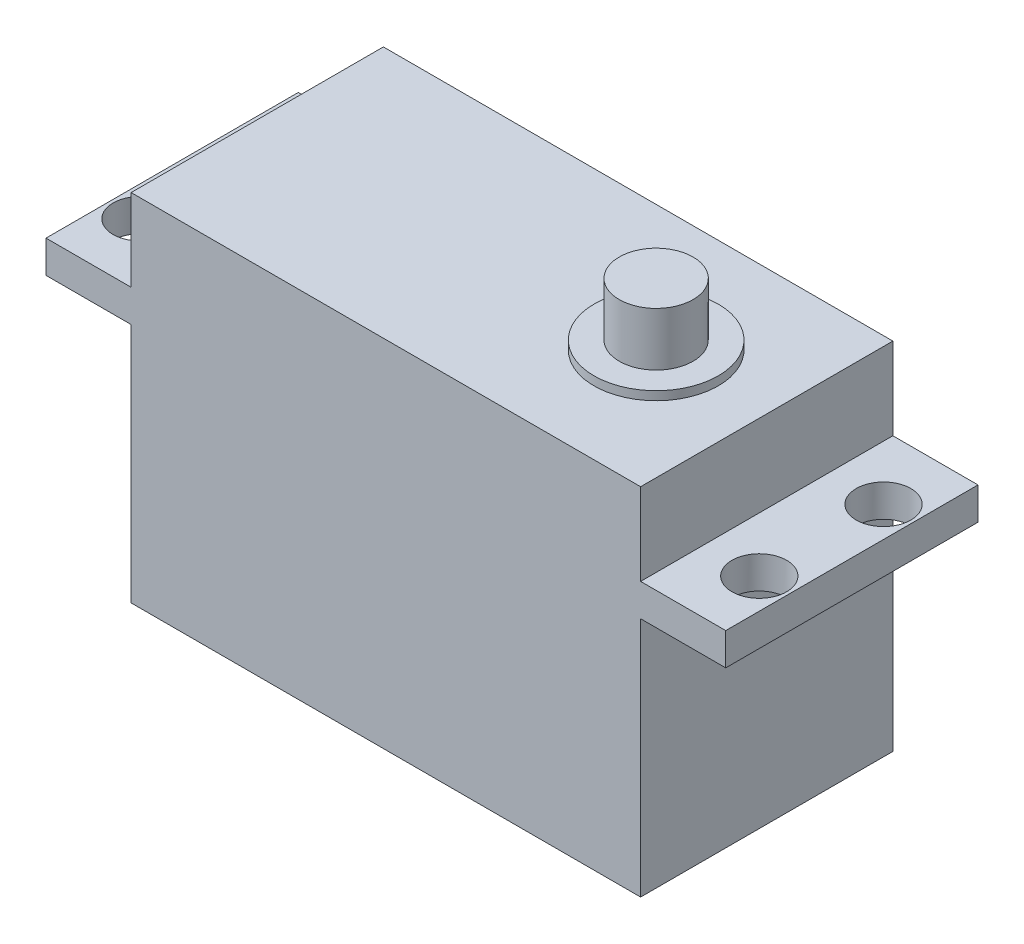
ISO-10303-21;
HEADER;
FILE_DESCRIPTION(('STEP AP214'),'2;1');
FILE_NAME('part.step','',(''),(''),'','','');
FILE_SCHEMA(('AUTOMOTIVE_DESIGN { 1 0 10303 214 1 1 1 1 }'));
ENDSEC;
DATA;
#1=APPLICATION_CONTEXT('core data for automotive mechanical design processes');
#2=APPLICATION_PROTOCOL_DEFINITION('international standard','automotive_design',2000,#1);
#3=PRODUCT_CONTEXT('',#1,'mechanical');
#4=PRODUCT('Part','Part','',(#3));
#5=PRODUCT_RELATED_PRODUCT_CATEGORY('part','',(#4));
#6=PRODUCT_DEFINITION_FORMATION('','',#4);
#7=PRODUCT_DEFINITION_CONTEXT('part definition',#1,'design');
#8=PRODUCT_DEFINITION('design','',#6,#7);
#9=PRODUCT_DEFINITION_SHAPE('','',#8);
#10=(LENGTH_UNIT() NAMED_UNIT(*) SI_UNIT(.MILLI.,.METRE.));
#11=(NAMED_UNIT(*) PLANE_ANGLE_UNIT() SI_UNIT($,.RADIAN.));
#12=(NAMED_UNIT(*) SI_UNIT($,.STERADIAN.) SOLID_ANGLE_UNIT());
#13=UNCERTAINTY_MEASURE_WITH_UNIT(LENGTH_MEASURE(1.E-05),#10,'distance_accuracy_value','');
#14=(GEOMETRIC_REPRESENTATION_CONTEXT(3) GLOBAL_UNCERTAINTY_ASSIGNED_CONTEXT((#13)) GLOBAL_UNIT_ASSIGNED_CONTEXT((#10,
#11,#12)) REPRESENTATION_CONTEXT('',''));
#15=CARTESIAN_POINT('',(0.,0.,0.));
#16=DIRECTION('',(0.,0.,1.));
#17=DIRECTION('',(1.,0.,0.));
#18=AXIS2_PLACEMENT_3D('',#15,#16,#17);
#19=CARTESIAN_POINT('',(0.,2.6,0.));
#20=DIRECTION('',(0.,-1.,0.));
#21=DIRECTION('',(0.,0.,-1.));
#22=AXIS2_PLACEMENT_3D('',#19,#20,#21);
#23=PLANE('',#22);
#24=CARTESIAN_POINT('',(-4.4,2.6,5.15));
#25=DIRECTION('',(0.,1.,0.));
#26=DIRECTION('',(0.,0.,1.));
#27=AXIS2_PLACEMENT_3D('',#24,#25,#26);
#28=CIRCLE('',#27,2.2);
#29=CARTESIAN_POINT('',(-4.4,2.6,7.35));
#30=VERTEX_POINT('',#29);
#31=EDGE_CURVE('E216',#30,#30,#28,.T.);
#32=ORIENTED_EDGE('',*,*,#31,.F.);
#33=EDGE_LOOP('',(#32));
#34=FACE_BOUND('',#33,.T.);
#35=CARTESIAN_POINT('',(-4.4,2.6,15.15));
#36=DIRECTION('',(0.,1.,0.));
#37=DIRECTION('',(0.,0.,1.));
#38=AXIS2_PLACEMENT_3D('',#35,#36,#37);
#39=CIRCLE('',#38,2.2);
#40=CARTESIAN_POINT('',(-4.4,2.6,17.35));
#41=VERTEX_POINT('',#40);
#42=EDGE_CURVE('E211',#41,#41,#39,.T.);
#43=ORIENTED_EDGE('',*,*,#42,.F.);
#44=EDGE_LOOP('',(#43));
#45=FACE_BOUND('',#44,.T.);
#46=DIRECTION('',(0.,0.,1.));
#47=VECTOR('',#46,1.);
#48=CARTESIAN_POINT('',(0.,2.6,20.3));
#49=LINE('',#48,#47);
#50=CARTESIAN_POINT('',(0.,2.6,0.));
#51=VERTEX_POINT('',#50);
#52=CARTESIAN_POINT('',(0.,2.6,20.3));
#53=VERTEX_POINT('',#52);
#54=EDGE_CURVE('E48',#51,#53,#49,.T.);
#55=ORIENTED_EDGE('',*,*,#54,.F.);
#56=DIRECTION('',(-1.,0.,0.));
#57=VECTOR('',#56,1.);
#58=CARTESIAN_POINT('',(-6.85,2.6,0.));
#59=LINE('',#58,#57);
#60=CARTESIAN_POINT('',(-6.85,2.6,0.));
#61=VERTEX_POINT('',#60);
#62=EDGE_CURVE('E162',#51,#61,#59,.T.);
#63=ORIENTED_EDGE('',*,*,#62,.T.);
#64=DIRECTION('',(0.,0.,1.));
#65=VECTOR('',#64,1.);
#66=CARTESIAN_POINT('',(-6.85,2.6,20.3));
#67=LINE('',#66,#65);
#68=CARTESIAN_POINT('',(-6.85,2.6,20.3));
#69=VERTEX_POINT('',#68);
#70=EDGE_CURVE('E153',#61,#69,#67,.T.);
#71=ORIENTED_EDGE('',*,*,#70,.T.);
#72=DIRECTION('',(1.,0.,0.));
#73=VECTOR('',#72,1.);
#74=CARTESIAN_POINT('',(-6.85,2.6,20.3));
#75=LINE('',#74,#73);
#76=EDGE_CURVE('E158',#69,#53,#75,.T.);
#77=ORIENTED_EDGE('',*,*,#76,.T.);
#78=EDGE_LOOP('',(#55,#63,#71,#77));
#79=FACE_BOUND('',#78,.T.);
#80=ADVANCED_FACE('F33',(#34,#45,#79),#23,.F.);
#81=CARTESIAN_POINT('',(45.4,2.6,15.15));
#82=DIRECTION('',(0.,1.,0.));
#83=DIRECTION('',(0.,0.,1.));
#84=AXIS2_PLACEMENT_3D('',#81,#82,#83);
#85=CIRCLE('',#84,2.2);
#86=CARTESIAN_POINT('',(45.4,2.6,17.35));
#87=VERTEX_POINT('',#86);
#88=EDGE_CURVE('E362',#87,#87,#85,.T.);
#89=ORIENTED_EDGE('',*,*,#88,.F.);
#90=EDGE_LOOP('',(#89));
#91=FACE_BOUND('',#90,.T.);
#92=CARTESIAN_POINT('',(45.4,2.6,5.15));
#93=DIRECTION('',(0.,1.,0.));
#94=DIRECTION('',(0.,0.,1.));
#95=AXIS2_PLACEMENT_3D('',#92,#93,#94);
#96=CIRCLE('',#95,2.2);
#97=CARTESIAN_POINT('',(45.4,2.6,7.35));
#98=VERTEX_POINT('',#97);
#99=EDGE_CURVE('E227',#98,#98,#96,.T.);
#100=ORIENTED_EDGE('',*,*,#99,.F.);
#101=EDGE_LOOP('',(#100));
#102=FACE_BOUND('',#101,.T.);
#103=DIRECTION('',(0.,0.,-1.));
#104=VECTOR('',#103,1.);
#105=CARTESIAN_POINT('',(41.,2.6,20.3));
#106=LINE('',#105,#104);
#107=CARTESIAN_POINT('',(41.,2.6,20.3));
#108=VERTEX_POINT('',#107);
#109=CARTESIAN_POINT('',(41.,2.6,0.));
#110=VERTEX_POINT('',#109);
#111=EDGE_CURVE('E56',#108,#110,#106,.T.);
#112=ORIENTED_EDGE('',*,*,#111,.F.);
#113=CARTESIAN_POINT('',(47.85,2.6,20.3));
#114=VERTEX_POINT('',#113);
#115=EDGE_CURVE('E156',#108,#114,#75,.T.);
#116=ORIENTED_EDGE('',*,*,#115,.T.);
#117=DIRECTION('',(0.,0.,-1.));
#118=VECTOR('',#117,1.);
#119=CARTESIAN_POINT('',(47.85,2.6,20.3));
#120=LINE('',#119,#118);
#121=CARTESIAN_POINT('',(47.85,2.6,0.));
#122=VERTEX_POINT('',#121);
#123=EDGE_CURVE('E160',#114,#122,#120,.T.);
#124=ORIENTED_EDGE('',*,*,#123,.T.);
#125=EDGE_CURVE('E163',#122,#110,#59,.T.);
#126=ORIENTED_EDGE('',*,*,#125,.T.);
#127=EDGE_LOOP('',(#112,#116,#124,#126));
#128=FACE_BOUND('',#127,.T.);
#129=ADVANCED_FACE('F255',(#91,#102,#128),#23,.F.);
#130=CARTESIAN_POINT('',(0.,0.,20.3));
#131=DIRECTION('',(1.,0.,0.));
#132=DIRECTION('',(0.,1.,0.));
#133=AXIS2_PLACEMENT_3D('',#130,#131,#132);
#134=PLANE('',#133);
#135=DIRECTION('',(0.,-1.,0.));
#136=VECTOR('',#135,1.);
#137=CARTESIAN_POINT('',(0.,0.,0.));
#138=LINE('',#137,#136);
#139=CARTESIAN_POINT('',(0.,0.,0.));
#140=VERTEX_POINT('',#139);
#141=CARTESIAN_POINT('',(0.,-19.4,0.));
#142=VERTEX_POINT('',#141);
#143=EDGE_CURVE('E185',#140,#142,#138,.T.);
#144=ORIENTED_EDGE('',*,*,#143,.T.);
#145=DIRECTION('',(0.,0.,-1.));
#146=VECTOR('',#145,1.);
#147=CARTESIAN_POINT('',(0.,-19.4,20.3));
#148=LINE('',#147,#146);
#149=CARTESIAN_POINT('',(0.,-19.4,20.3));
#150=VERTEX_POINT('',#149);
#151=EDGE_CURVE('E41',#150,#142,#148,.T.);
#152=ORIENTED_EDGE('',*,*,#151,.F.);
#153=DIRECTION('',(0.,-1.,0.));
#154=VECTOR('',#153,1.);
#155=CARTESIAN_POINT('',(0.,0.,20.3));
#156=LINE('',#155,#154);
#157=CARTESIAN_POINT('',(0.,0.,20.3));
#158=VERTEX_POINT('',#157);
#159=EDGE_CURVE('E186',#158,#150,#156,.T.);
#160=ORIENTED_EDGE('',*,*,#159,.F.);
#161=DIRECTION('',(0.,0.,-1.));
#162=VECTOR('',#161,1.);
#163=CARTESIAN_POINT('',(0.,0.,20.3));
#164=LINE('',#163,#162);
#165=EDGE_CURVE('E193',#158,#140,#164,.T.);
#166=ORIENTED_EDGE('',*,*,#165,.T.);
#167=EDGE_LOOP('',(#144,#152,#160,#166));
#168=FACE_BOUND('',#167,.T.);
#169=ADVANCED_FACE('F35',(#168),#134,.F.);
#170=CARTESIAN_POINT('',(0.,-19.4,20.3));
#171=DIRECTION('',(0.,1.,0.));
#172=DIRECTION('',(0.,0.,1.));
#173=AXIS2_PLACEMENT_3D('',#170,#171,#172);
#174=PLANE('',#173);
#175=DIRECTION('',(1.,0.,0.));
#176=VECTOR('',#175,1.);
#177=CARTESIAN_POINT('',(0.,-19.4,0.));
#178=LINE('',#177,#176);
#179=CARTESIAN_POINT('',(41.,-19.4,0.));
#180=VERTEX_POINT('',#179);
#181=EDGE_CURVE('E196',#142,#180,#178,.T.);
#182=ORIENTED_EDGE('',*,*,#181,.T.);
#183=DIRECTION('',(0.,0.,-1.));
#184=VECTOR('',#183,1.);
#185=CARTESIAN_POINT('',(41.,-19.4,20.3));
#186=LINE('',#185,#184);
#187=CARTESIAN_POINT('',(41.,-19.4,20.3));
#188=VERTEX_POINT('',#187);
#189=EDGE_CURVE('E203',#188,#180,#186,.T.);
#190=ORIENTED_EDGE('',*,*,#189,.F.);
#191=DIRECTION('',(1.,0.,0.));
#192=VECTOR('',#191,1.);
#193=CARTESIAN_POINT('',(0.,-19.4,20.3));
#194=LINE('',#193,#192);
#195=EDGE_CURVE('E188',#150,#188,#194,.T.);
#196=ORIENTED_EDGE('',*,*,#195,.F.);
#197=ORIENTED_EDGE('',*,*,#151,.T.);
#198=EDGE_LOOP('',(#182,#190,#196,#197));
#199=FACE_BOUND('',#198,.T.);
#200=ADVANCED_FACE('F283',(#199),#174,.F.);
#201=CARTESIAN_POINT('',(41.,0.,20.3));
#202=DIRECTION('',(-1.,0.,0.));
#203=DIRECTION('',(0.,-1.,0.));
#204=AXIS2_PLACEMENT_3D('',#201,#202,#203);
#205=PLANE('',#204);
#206=DIRECTION('',(0.,1.,0.));
#207=VECTOR('',#206,1.);
#208=CARTESIAN_POINT('',(41.,0.,0.));
#209=LINE('',#208,#207);
#210=CARTESIAN_POINT('',(41.,0.,0.));
#211=VERTEX_POINT('',#210);
#212=EDGE_CURVE('E189',#180,#211,#209,.T.);
#213=ORIENTED_EDGE('',*,*,#212,.T.);
#214=DIRECTION('',(0.,0.,-1.));
#215=VECTOR('',#214,1.);
#216=CARTESIAN_POINT('',(41.,0.,20.3));
#217=LINE('',#216,#215);
#218=CARTESIAN_POINT('',(41.,0.,20.3));
#219=VERTEX_POINT('',#218);
#220=EDGE_CURVE('E200',#219,#211,#217,.T.);
#221=ORIENTED_EDGE('',*,*,#220,.F.);
#222=DIRECTION('',(0.,1.,0.));
#223=VECTOR('',#222,1.);
#224=CARTESIAN_POINT('',(41.,0.,20.3));
#225=LINE('',#224,#223);
#226=EDGE_CURVE('E191',#188,#219,#225,.T.);
#227=ORIENTED_EDGE('',*,*,#226,.F.);
#228=ORIENTED_EDGE('',*,*,#189,.T.);
#229=EDGE_LOOP('',(#213,#221,#227,#228));
#230=FACE_BOUND('',#229,.T.);
#231=ADVANCED_FACE('F279',(#230),#205,.F.);
#232=CARTESIAN_POINT('',(0.,0.,20.3));
#233=DIRECTION('',(0.,0.,1.));
#234=DIRECTION('',(1.,0.,0.));
#235=AXIS2_PLACEMENT_3D('',#232,#233,#234);
#236=PLANE('',#235);
#237=ORIENTED_EDGE('',*,*,#159,.T.);
#238=ORIENTED_EDGE('',*,*,#195,.T.);
#239=ORIENTED_EDGE('',*,*,#226,.T.);
#240=DIRECTION('',(1.,0.,0.));
#241=VECTOR('',#240,1.);
#242=CARTESIAN_POINT('',(-6.85,0.,20.3));
#243=LINE('',#242,#241);
#244=CARTESIAN_POINT('',(47.85,0.,20.3));
#245=VERTEX_POINT('',#244);
#246=EDGE_CURVE('E147',#219,#245,#243,.T.);
#247=ORIENTED_EDGE('',*,*,#246,.T.);
#248=DIRECTION('',(0.,-1.,0.));
#249=VECTOR('',#248,1.);
#250=CARTESIAN_POINT('',(47.85,2.6,20.3));
#251=LINE('',#250,#249);
#252=EDGE_CURVE('E179',#114,#245,#251,.T.);
#253=ORIENTED_EDGE('',*,*,#252,.F.);
#254=ORIENTED_EDGE('',*,*,#115,.F.);
#255=DIRECTION('',(0.,-1.,0.));
#256=VECTOR('',#255,1.);
#257=CARTESIAN_POINT('',(41.,9.2,20.3));
#258=LINE('',#257,#256);
#259=CARTESIAN_POINT('',(41.,9.2,20.3));
#260=VERTEX_POINT('',#259);
#261=EDGE_CURVE('E129',#260,#108,#258,.T.);
#262=ORIENTED_EDGE('',*,*,#261,.F.);
#263=DIRECTION('',(1.,0.,0.));
#264=VECTOR('',#263,1.);
#265=CARTESIAN_POINT('',(0.,9.2,20.3));
#266=LINE('',#265,#264);
#267=CARTESIAN_POINT('',(0.,9.2,20.3));
#268=VERTEX_POINT('',#267);
#269=EDGE_CURVE('E122',#268,#260,#266,.T.);
#270=ORIENTED_EDGE('',*,*,#269,.F.);
#271=DIRECTION('',(0.,-1.,0.));
#272=VECTOR('',#271,1.);
#273=CARTESIAN_POINT('',(0.,9.2,20.3));
#274=LINE('',#273,#272);
#275=EDGE_CURVE('E127',#268,#53,#274,.T.);
#276=ORIENTED_EDGE('',*,*,#275,.T.);
#277=ORIENTED_EDGE('',*,*,#76,.F.);
#278=DIRECTION('',(0.,-1.,0.));
#279=VECTOR('',#278,1.);
#280=CARTESIAN_POINT('',(-6.85,2.6,20.3));
#281=LINE('',#280,#279);
#282=CARTESIAN_POINT('',(-6.85,0.,20.3));
#283=VERTEX_POINT('',#282);
#284=EDGE_CURVE('E182',#69,#283,#281,.T.);
#285=ORIENTED_EDGE('',*,*,#284,.T.);
#286=EDGE_CURVE('E166',#283,#158,#243,.T.);
#287=ORIENTED_EDGE('',*,*,#286,.T.);
#288=EDGE_LOOP('',(#237,#238,#239,#247,#253,#254,#262,#270,#276,#277,#285,#287));
#289=FACE_BOUND('',#288,.T.);
#290=ADVANCED_FACE('F125',(#289),#236,.T.);
#291=CARTESIAN_POINT('',(0.,0.,0.));
#292=DIRECTION('',(0.,0.,1.));
#293=DIRECTION('',(1.,0.,0.));
#294=AXIS2_PLACEMENT_3D('',#291,#292,#293);
#295=PLANE('',#294);
#296=ORIENTED_EDGE('',*,*,#143,.F.);
#297=DIRECTION('',(-1.,0.,0.));
#298=VECTOR('',#297,1.);
#299=CARTESIAN_POINT('',(-6.85,0.,0.));
#300=LINE('',#299,#298);
#301=CARTESIAN_POINT('',(-6.85,0.,0.));
#302=VERTEX_POINT('',#301);
#303=EDGE_CURVE('E171',#140,#302,#300,.T.);
#304=ORIENTED_EDGE('',*,*,#303,.T.);
#305=DIRECTION('',(0.,-1.,0.));
#306=VECTOR('',#305,1.);
#307=CARTESIAN_POINT('',(-6.85,2.6,0.));
#308=LINE('',#307,#306);
#309=EDGE_CURVE('E164',#61,#302,#308,.T.);
#310=ORIENTED_EDGE('',*,*,#309,.F.);
#311=ORIENTED_EDGE('',*,*,#62,.F.);
#312=DIRECTION('',(0.,-1.,0.));
#313=VECTOR('',#312,1.);
#314=CARTESIAN_POINT('',(0.,9.2,0.));
#315=LINE('',#314,#313);
#316=CARTESIAN_POINT('',(0.,9.2,0.));
#317=VERTEX_POINT('',#316);
#318=EDGE_CURVE('E232',#317,#51,#315,.T.);
#319=ORIENTED_EDGE('',*,*,#318,.F.);
#320=DIRECTION('',(-1.,0.,0.));
#321=VECTOR('',#320,1.);
#322=CARTESIAN_POINT('',(0.,9.2,0.));
#323=LINE('',#322,#321);
#324=CARTESIAN_POINT('',(41.,9.2,0.));
#325=VERTEX_POINT('',#324);
#326=EDGE_CURVE('E138',#325,#317,#323,.T.);
#327=ORIENTED_EDGE('',*,*,#326,.F.);
#328=DIRECTION('',(0.,-1.,0.));
#329=VECTOR('',#328,1.);
#330=CARTESIAN_POINT('',(41.,9.2,0.));
#331=LINE('',#330,#329);
#332=EDGE_CURVE('E149',#325,#110,#331,.T.);
#333=ORIENTED_EDGE('',*,*,#332,.T.);
#334=ORIENTED_EDGE('',*,*,#125,.F.);
#335=DIRECTION('',(0.,-1.,0.));
#336=VECTOR('',#335,1.);
#337=CARTESIAN_POINT('',(47.85,2.6,0.));
#338=LINE('',#337,#336);
#339=CARTESIAN_POINT('',(47.85,0.,0.));
#340=VERTEX_POINT('',#339);
#341=EDGE_CURVE('E176',#122,#340,#338,.T.);
#342=ORIENTED_EDGE('',*,*,#341,.T.);
#343=EDGE_CURVE('E157',#340,#211,#300,.T.);
#344=ORIENTED_EDGE('',*,*,#343,.T.);
#345=ORIENTED_EDGE('',*,*,#212,.F.);
#346=ORIENTED_EDGE('',*,*,#181,.F.);
#347=EDGE_LOOP('',(#296,#304,#310,#311,#319,#327,#333,#334,#342,#344,#345,#346));
#348=FACE_BOUND('',#347,.T.);
#349=ADVANCED_FACE('F240',(#348),#295,.F.);
#350=CARTESIAN_POINT('',(0.,0.,0.));
#351=DIRECTION('',(0.,-1.,0.));
#352=DIRECTION('',(0.,0.,-1.));
#353=AXIS2_PLACEMENT_3D('',#350,#351,#352);
#354=PLANE('',#353);
#355=CARTESIAN_POINT('',(-4.4,0.,5.15));
#356=DIRECTION('',(0.,-1.,0.));
#357=DIRECTION('',(0.,0.,-1.));
#358=AXIS2_PLACEMENT_3D('',#355,#356,#357);
#359=CIRCLE('',#358,2.2);
#360=CARTESIAN_POINT('',(-4.4,0.,2.95));
#361=VERTEX_POINT('',#360);
#362=EDGE_CURVE('E218',#361,#361,#359,.T.);
#363=ORIENTED_EDGE('',*,*,#362,.F.);
#364=EDGE_LOOP('',(#363));
#365=FACE_BOUND('',#364,.T.);
#366=CARTESIAN_POINT('',(-4.4,0.,15.15));
#367=DIRECTION('',(0.,-1.,0.));
#368=DIRECTION('',(0.,0.,-1.));
#369=AXIS2_PLACEMENT_3D('',#366,#367,#368);
#370=CIRCLE('',#369,2.2);
#371=CARTESIAN_POINT('',(-4.4,0.,12.95));
#372=VERTEX_POINT('',#371);
#373=EDGE_CURVE('E208',#372,#372,#370,.T.);
#374=ORIENTED_EDGE('',*,*,#373,.F.);
#375=EDGE_LOOP('',(#374));
#376=FACE_BOUND('',#375,.T.);
#377=ORIENTED_EDGE('',*,*,#165,.F.);
#378=ORIENTED_EDGE('',*,*,#286,.F.);
#379=DIRECTION('',(0.,0.,1.));
#380=VECTOR('',#379,1.);
#381=CARTESIAN_POINT('',(-6.85,0.,20.3));
#382=LINE('',#381,#380);
#383=EDGE_CURVE('E144',#302,#283,#382,.T.);
#384=ORIENTED_EDGE('',*,*,#383,.F.);
#385=ORIENTED_EDGE('',*,*,#303,.F.);
#386=EDGE_LOOP('',(#377,#378,#384,#385));
#387=FACE_BOUND('',#386,.T.);
#388=ADVANCED_FACE('F269',(#365,#376,#387),#354,.T.);
#389=CARTESIAN_POINT('',(-6.85,2.6,20.3));
#390=DIRECTION('',(1.,0.,0.));
#391=DIRECTION('',(0.,0.,-1.));
#392=AXIS2_PLACEMENT_3D('',#389,#390,#391);
#393=PLANE('',#392);
#394=ORIENTED_EDGE('',*,*,#383,.T.);
#395=ORIENTED_EDGE('',*,*,#284,.F.);
#396=ORIENTED_EDGE('',*,*,#70,.F.);
#397=ORIENTED_EDGE('',*,*,#309,.T.);
#398=EDGE_LOOP('',(#394,#395,#396,#397));
#399=FACE_BOUND('',#398,.T.);
#400=ADVANCED_FACE('F272',(#399),#393,.F.);
#401=CARTESIAN_POINT('',(47.85,2.6,20.3));
#402=DIRECTION('',(-1.,0.,0.));
#403=DIRECTION('',(0.,0.,1.));
#404=AXIS2_PLACEMENT_3D('',#401,#402,#403);
#405=PLANE('',#404);
#406=DIRECTION('',(0.,0.,-1.));
#407=VECTOR('',#406,1.);
#408=CARTESIAN_POINT('',(47.85,0.,20.3));
#409=LINE('',#408,#407);
#410=EDGE_CURVE('E169',#245,#340,#409,.T.);
#411=ORIENTED_EDGE('',*,*,#410,.T.);
#412=ORIENTED_EDGE('',*,*,#341,.F.);
#413=ORIENTED_EDGE('',*,*,#123,.F.);
#414=ORIENTED_EDGE('',*,*,#252,.T.);
#415=EDGE_LOOP('',(#411,#412,#413,#414));
#416=FACE_BOUND('',#415,.T.);
#417=ADVANCED_FACE('F267',(#416),#405,.F.);
#418=CARTESIAN_POINT('',(45.4,0.,15.15));
#419=DIRECTION('',(0.,-1.,0.));
#420=DIRECTION('',(0.,0.,-1.));
#421=AXIS2_PLACEMENT_3D('',#418,#419,#420);
#422=CIRCLE('',#421,2.2);
#423=CARTESIAN_POINT('',(45.4,0.,12.95));
#424=VERTEX_POINT('',#423);
#425=EDGE_CURVE('E215',#424,#424,#422,.T.);
#426=ORIENTED_EDGE('',*,*,#425,.F.);
#427=EDGE_LOOP('',(#426));
#428=FACE_BOUND('',#427,.T.);
#429=CARTESIAN_POINT('',(45.4,0.,5.15));
#430=DIRECTION('',(0.,-1.,0.));
#431=DIRECTION('',(0.,0.,-1.));
#432=AXIS2_PLACEMENT_3D('',#429,#430,#431);
#433=CIRCLE('',#432,2.2);
#434=CARTESIAN_POINT('',(45.4,0.,2.95));
#435=VERTEX_POINT('',#434);
#436=EDGE_CURVE('E212',#435,#435,#433,.T.);
#437=ORIENTED_EDGE('',*,*,#436,.F.);
#438=EDGE_LOOP('',(#437));
#439=FACE_BOUND('',#438,.T.);
#440=ORIENTED_EDGE('',*,*,#246,.F.);
#441=ORIENTED_EDGE('',*,*,#220,.T.);
#442=ORIENTED_EDGE('',*,*,#343,.F.);
#443=ORIENTED_EDGE('',*,*,#410,.F.);
#444=EDGE_LOOP('',(#440,#441,#442,#443));
#445=FACE_BOUND('',#444,.T.);
#446=ADVANCED_FACE('F252',(#428,#439,#445),#354,.T.);
#447=CARTESIAN_POINT('',(0.,9.2,20.3));
#448=DIRECTION('',(1.,0.,0.));
#449=DIRECTION('',(0.,0.,-1.));
#450=AXIS2_PLACEMENT_3D('',#447,#448,#449);
#451=PLANE('',#450);
#452=ORIENTED_EDGE('',*,*,#54,.T.);
#453=ORIENTED_EDGE('',*,*,#275,.F.);
#454=DIRECTION('',(0.,0.,1.));
#455=VECTOR('',#454,1.);
#456=CARTESIAN_POINT('',(0.,9.2,20.3));
#457=LINE('',#456,#455);
#458=EDGE_CURVE('E133',#317,#268,#457,.T.);
#459=ORIENTED_EDGE('',*,*,#458,.F.);
#460=ORIENTED_EDGE('',*,*,#318,.T.);
#461=EDGE_LOOP('',(#452,#453,#459,#460));
#462=FACE_BOUND('',#461,.T.);
#463=ADVANCED_FACE('F143',(#462),#451,.F.);
#464=CARTESIAN_POINT('',(41.,9.2,20.3));
#465=DIRECTION('',(-1.,0.,0.));
#466=DIRECTION('',(0.,0.,1.));
#467=AXIS2_PLACEMENT_3D('',#464,#465,#466);
#468=PLANE('',#467);
#469=ORIENTED_EDGE('',*,*,#111,.T.);
#470=ORIENTED_EDGE('',*,*,#332,.F.);
#471=DIRECTION('',(0.,0.,-1.));
#472=VECTOR('',#471,1.);
#473=CARTESIAN_POINT('',(41.,9.2,20.3));
#474=LINE('',#473,#472);
#475=EDGE_CURVE('E132',#260,#325,#474,.T.);
#476=ORIENTED_EDGE('',*,*,#475,.F.);
#477=ORIENTED_EDGE('',*,*,#261,.T.);
#478=EDGE_LOOP('',(#469,#470,#476,#477));
#479=FACE_BOUND('',#478,.T.);
#480=ADVANCED_FACE('F242',(#479),#468,.F.);
#481=CARTESIAN_POINT('',(0.,9.2,0.));
#482=DIRECTION('',(0.,-1.,0.));
#483=DIRECTION('',(0.,0.,-1.));
#484=AXIS2_PLACEMENT_3D('',#481,#482,#483);
#485=PLANE('',#484);
#486=CARTESIAN_POINT('',(32.1,9.2,10.15));
#487=DIRECTION('',(0.,-1.,0.));
#488=DIRECTION('',(0.,0.,-1.));
#489=AXIS2_PLACEMENT_3D('',#486,#487,#488);
#490=CIRCLE('',#489,5.);
#491=CARTESIAN_POINT('',(32.1,9.2,5.15));
#492=VERTEX_POINT('',#491);
#493=EDGE_CURVE('E11',#492,#492,#490,.F.);
#494=ORIENTED_EDGE('',*,*,#493,.F.);
#495=EDGE_LOOP('',(#494));
#496=FACE_BOUND('',#495,.T.);
#497=ORIENTED_EDGE('',*,*,#458,.T.);
#498=ORIENTED_EDGE('',*,*,#269,.T.);
#499=ORIENTED_EDGE('',*,*,#475,.T.);
#500=ORIENTED_EDGE('',*,*,#326,.T.);
#501=EDGE_LOOP('',(#497,#498,#499,#500));
#502=FACE_BOUND('',#501,.T.);
#503=ADVANCED_FACE('F136',(#496,#502),#485,.F.);
#504=CARTESIAN_POINT('',(-4.4,-19.4,15.15));
#505=DIRECTION('',(0.,1.,0.));
#506=DIRECTION('',(0.,0.,1.));
#507=AXIS2_PLACEMENT_3D('',#504,#505,#506);
#508=CYLINDRICAL_SURFACE('',#507,2.2);
#509=ORIENTED_EDGE('',*,*,#373,.T.);
#510=EDGE_LOOP('',(#509));
#511=FACE_BOUND('',#510,.T.);
#512=ORIENTED_EDGE('',*,*,#42,.T.);
#513=EDGE_LOOP('',(#512));
#514=FACE_BOUND('',#513,.T.);
#515=ADVANCED_FACE('F249',(#511,#514),#508,.F.);
#516=CARTESIAN_POINT('',(45.4,-19.4,5.15));
#517=DIRECTION('',(0.,1.,0.));
#518=DIRECTION('',(0.,0.,1.));
#519=AXIS2_PLACEMENT_3D('',#516,#517,#518);
#520=CYLINDRICAL_SURFACE('',#519,2.2);
#521=ORIENTED_EDGE('',*,*,#436,.T.);
#522=EDGE_LOOP('',(#521));
#523=FACE_BOUND('',#522,.T.);
#524=ORIENTED_EDGE('',*,*,#99,.T.);
#525=EDGE_LOOP('',(#524));
#526=FACE_BOUND('',#525,.T.);
#527=ADVANCED_FACE('F318',(#523,#526),#520,.F.);
#528=CARTESIAN_POINT('',(45.4,-19.4,15.15));
#529=DIRECTION('',(0.,1.,0.));
#530=DIRECTION('',(0.,0.,1.));
#531=AXIS2_PLACEMENT_3D('',#528,#529,#530);
#532=CYLINDRICAL_SURFACE('',#531,2.2);
#533=ORIENTED_EDGE('',*,*,#425,.T.);
#534=EDGE_LOOP('',(#533));
#535=FACE_BOUND('',#534,.T.);
#536=ORIENTED_EDGE('',*,*,#88,.T.);
#537=EDGE_LOOP('',(#536));
#538=FACE_BOUND('',#537,.T.);
#539=ADVANCED_FACE('F323',(#535,#538),#532,.F.);
#540=CARTESIAN_POINT('',(-4.4,-19.4,5.15));
#541=DIRECTION('',(0.,1.,0.));
#542=DIRECTION('',(0.,0.,1.));
#543=AXIS2_PLACEMENT_3D('',#540,#541,#542);
#544=CYLINDRICAL_SURFACE('',#543,2.2);
#545=ORIENTED_EDGE('',*,*,#362,.T.);
#546=EDGE_LOOP('',(#545));
#547=FACE_BOUND('',#546,.T.);
#548=ORIENTED_EDGE('',*,*,#31,.T.);
#549=EDGE_LOOP('',(#548));
#550=FACE_BOUND('',#549,.T.);
#551=ADVANCED_FACE('F329',(#547,#550),#544,.F.);
#552=CARTESIAN_POINT('',(32.1,9.9,10.15));
#553=DIRECTION('',(0.,-1.,0.));
#554=DIRECTION('',(0.,0.,-1.));
#555=AXIS2_PLACEMENT_3D('',#552,#553,#554);
#556=CYLINDRICAL_SURFACE('',#555,5.);
#557=CARTESIAN_POINT('',(32.1,9.9,10.15));
#558=DIRECTION('',(0.,1.,0.));
#559=DIRECTION('',(0.,0.,1.));
#560=AXIS2_PLACEMENT_3D('',#557,#558,#559);
#561=CIRCLE('',#560,5.);
#562=CARTESIAN_POINT('',(32.1,9.9,15.15));
#563=VERTEX_POINT('',#562);
#564=EDGE_CURVE('E353',#563,#563,#561,.T.);
#565=ORIENTED_EDGE('',*,*,#564,.F.);
#566=EDGE_LOOP('',(#565));
#567=FACE_BOUND('',#566,.T.);
#568=ORIENTED_EDGE('',*,*,#493,.T.);
#569=EDGE_LOOP('',(#568));
#570=FACE_BOUND('',#569,.T.);
#571=ADVANCED_FACE('F333',(#567,#570),#556,.T.);
#572=CARTESIAN_POINT('',(32.1,9.9,10.15));
#573=DIRECTION('',(0.,1.,0.));
#574=DIRECTION('',(0.,0.,1.));
#575=AXIS2_PLACEMENT_3D('',#572,#573,#574);
#576=PLANE('',#575);
#577=CARTESIAN_POINT('',(32.1,9.9,10.15));
#578=DIRECTION('',(0.,1.,0.));
#579=DIRECTION('',(0.,0.,1.));
#580=AXIS2_PLACEMENT_3D('',#577,#578,#579);
#581=CIRCLE('',#580,2.97);
#582=CARTESIAN_POINT('',(32.1,9.9,7.18));
#583=VERTEX_POINT('',#582);
#584=EDGE_CURVE('E354',#583,#583,#581,.T.);
#585=ORIENTED_EDGE('',*,*,#584,.F.);
#586=EDGE_LOOP('',(#585));
#587=FACE_BOUND('',#586,.T.);
#588=ORIENTED_EDGE('',*,*,#564,.T.);
#589=EDGE_LOOP('',(#588));
#590=FACE_BOUND('',#589,.T.);
#591=ADVANCED_FACE('F336',(#587,#590),#576,.T.);
#592=CARTESIAN_POINT('',(32.1,14.2,10.15));
#593=DIRECTION('',(0.,-1.,0.));
#594=DIRECTION('',(0.,0.,-1.));
#595=AXIS2_PLACEMENT_3D('',#592,#593,#594);
#596=CYLINDRICAL_SURFACE('',#595,2.97);
#597=CARTESIAN_POINT('',(32.1,14.2,10.15));
#598=DIRECTION('',(0.,1.,0.));
#599=DIRECTION('',(0.,0.,1.));
#600=AXIS2_PLACEMENT_3D('',#597,#598,#599);
#601=CIRCLE('',#600,2.97);
#602=CARTESIAN_POINT('',(32.1,14.2,7.18));
#603=VERTEX_POINT('',#602);
#604=EDGE_CURVE('E352',#603,#603,#601,.T.);
#605=CARTESIAN_POINT('',(32.1,14.2,7.18));
#606=CARTESIAN_POINT('',(32.1,14.1552083333333,7.18));
#607=CARTESIAN_POINT('',(32.1,14.1104166666667,7.18));
#608=CARTESIAN_POINT('',(32.1,14.0208333333333,7.18));
#609=CARTESIAN_POINT('',(32.1,13.9760416666667,7.18));
#610=CARTESIAN_POINT('',(32.1,13.8864583333333,7.18));
#611=CARTESIAN_POINT('',(32.1,13.8416666666667,7.18));
#612=CARTESIAN_POINT('',(32.1,13.7520833333333,7.18));
#613=CARTESIAN_POINT('',(32.1,13.7072916666667,7.18));
#614=CARTESIAN_POINT('',(32.1,13.6177083333333,7.18));
#615=CARTESIAN_POINT('',(32.1,13.5729166666667,7.18));
#616=CARTESIAN_POINT('',(32.1,13.4833333333333,7.18));
#617=CARTESIAN_POINT('',(32.1,13.4385416666667,7.18));
#618=CARTESIAN_POINT('',(32.1,13.3489583333333,7.18));
#619=CARTESIAN_POINT('',(32.1,13.3041666666667,7.18));
#620=CARTESIAN_POINT('',(32.1,13.2145833333333,7.18));
#621=CARTESIAN_POINT('',(32.1,13.1697916666667,7.18));
#622=CARTESIAN_POINT('',(32.1,13.0802083333333,7.18));
#623=CARTESIAN_POINT('',(32.1,13.0354166666667,7.18));
#624=CARTESIAN_POINT('',(32.1,12.9458333333333,7.18));
#625=CARTESIAN_POINT('',(32.1,12.9010416666667,7.18));
#626=CARTESIAN_POINT('',(32.1,12.8114583333333,7.18));
#627=CARTESIAN_POINT('',(32.1,12.7666666666667,7.18));
#628=CARTESIAN_POINT('',(32.1,12.6770833333333,7.18));
#629=CARTESIAN_POINT('',(32.1,12.6322916666667,7.18));
#630=CARTESIAN_POINT('',(32.1,12.5427083333333,7.18));
#631=CARTESIAN_POINT('',(32.1,12.4979166666667,7.18));
#632=CARTESIAN_POINT('',(32.1,12.4083333333333,7.18));
#633=CARTESIAN_POINT('',(32.1,12.3635416666667,7.18));
#634=CARTESIAN_POINT('',(32.1,12.2739583333333,7.18));
#635=CARTESIAN_POINT('',(32.1,12.2291666666667,7.18));
#636=CARTESIAN_POINT('',(32.1,12.1395833333333,7.18));
#637=CARTESIAN_POINT('',(32.1,12.0947916666667,7.18));
#638=CARTESIAN_POINT('',(32.1,12.0052083333333,7.18));
#639=CARTESIAN_POINT('',(32.1,11.9604166666667,7.18));
#640=CARTESIAN_POINT('',(32.1,11.8708333333333,7.18));
#641=CARTESIAN_POINT('',(32.1,11.8260416666667,7.18));
#642=CARTESIAN_POINT('',(32.1,11.7364583333333,7.18));
#643=CARTESIAN_POINT('',(32.1,11.6916666666667,7.18));
#644=CARTESIAN_POINT('',(32.1,11.6020833333333,7.18));
#645=CARTESIAN_POINT('',(32.1,11.5572916666667,7.18));
#646=CARTESIAN_POINT('',(32.1,11.4677083333333,7.18));
#647=CARTESIAN_POINT('',(32.1,11.4229166666667,7.18));
#648=CARTESIAN_POINT('',(32.1,11.3333333333333,7.18));
#649=CARTESIAN_POINT('',(32.1,11.2885416666667,7.18));
#650=CARTESIAN_POINT('',(32.1,11.1989583333333,7.18));
#651=CARTESIAN_POINT('',(32.1,11.1541666666667,7.18));
#652=CARTESIAN_POINT('',(32.1,11.0645833333333,7.18));
#653=CARTESIAN_POINT('',(32.1,11.0197916666667,7.18));
#654=CARTESIAN_POINT('',(32.1,10.9302083333333,7.18));
#655=CARTESIAN_POINT('',(32.1,10.8854166666667,7.18));
#656=CARTESIAN_POINT('',(32.1,10.7958333333333,7.18));
#657=CARTESIAN_POINT('',(32.1,10.7510416666667,7.18));
#658=CARTESIAN_POINT('',(32.1,10.6614583333333,7.18));
#659=CARTESIAN_POINT('',(32.1,10.6166666666667,7.18));
#660=CARTESIAN_POINT('',(32.1,10.5270833333333,7.18));
#661=CARTESIAN_POINT('',(32.1,10.4822916666667,7.18));
#662=CARTESIAN_POINT('',(32.1,10.3927083333333,7.18));
#663=CARTESIAN_POINT('',(32.1,10.3479166666667,7.18));
#664=CARTESIAN_POINT('',(32.1,10.2583333333333,7.18));
#665=CARTESIAN_POINT('',(32.1,10.2135416666667,7.18));
#666=CARTESIAN_POINT('',(32.1,10.1239583333333,7.18));
#667=CARTESIAN_POINT('',(32.1,10.0791666666667,7.18));
#668=CARTESIAN_POINT('',(32.1,9.98958333333333,7.18));
#669=CARTESIAN_POINT('',(32.1,9.94479166666667,7.18));
#670=CARTESIAN_POINT('',(32.1,9.9,7.18));
#671=B_SPLINE_CURVE_WITH_KNOTS('',3,(#605,#606,#607,#608,#609,#610,#611,#612,#613,#614,#615,
#616,#617,#618,#619,#620,#621,#622,#623,#624,#625,#626,#627,#628,#629,#630,#631,#632,#633,#634,
#635,#636,#637,#638,#639,#640,#641,#642,#643,#644,#645,#646,#647,#648,#649,#650,#651,#652,#653,
#654,#655,#656,#657,#658,#659,#660,#661,#662,#663,#664,#665,#666,#667,#668,#669,#670),
.UNSPECIFIED.,.F.,.F.,(4,2,2,2,2,2,2,2,2,2,2,2,2,2,2,2,2,2,2,2,2,2,2,2,2,2,2,2,2,2,2,2,4),(0.,
0.134374999999999,0.26875,0.403124999999999,0.5375,0.671874999999999,0.80625,0.940624999999999,
1.075,1.209375,1.34375,1.478125,1.6125,1.746875,1.88125,2.015625,2.15,2.284375,2.41875,2.553125,
2.6875,2.821875,2.95625,3.090625,3.225,3.359375,3.49375,3.628125,3.7625,3.896875,4.03125,
4.165625,4.3),.UNSPECIFIED.);
#672=EDGE_CURVE('BSEAM340',#603,#583,#671,.T.);
#673=ORIENTED_EDGE('',*,*,#604,.F.);
#674=ORIENTED_EDGE('',*,*,#584,.T.);
#675=ORIENTED_EDGE('',*,*,#672,.T.);
#676=ORIENTED_EDGE('',*,*,#672,.F.);
#677=EDGE_LOOP('',(#673,#675,#674,#676));
#678=FACE_BOUND('',#677,.T.);
#679=ADVANCED_FACE('F340',(#678),#596,.T.);
#680=CARTESIAN_POINT('',(32.1,14.2,10.15));
#681=DIRECTION('',(0.,1.,0.));
#682=DIRECTION('',(0.,0.,1.));
#683=AXIS2_PLACEMENT_3D('',#680,#681,#682);
#684=PLANE('',#683);
#685=ORIENTED_EDGE('',*,*,#604,.T.);
#686=EDGE_LOOP('',(#685));
#687=FACE_BOUND('',#686,.T.);
#688=ADVANCED_FACE('F344',(#687),#684,.T.);
#689=CLOSED_SHELL('',(#80,#129,#169,#200,#231,#290,#349,#388,#400,#417,#446,#463,#480,#503,#515,
#527,#539,#551,#571,#591,#679,#688));
#690=MANIFOLD_SOLID_BREP('B2',#689);
#691=ADVANCED_BREP_SHAPE_REPRESENTATION('',(#18,#690),#14);
#692=SHAPE_DEFINITION_REPRESENTATION(#9,#691);
ENDSEC;
END-ISO-10303-21;
